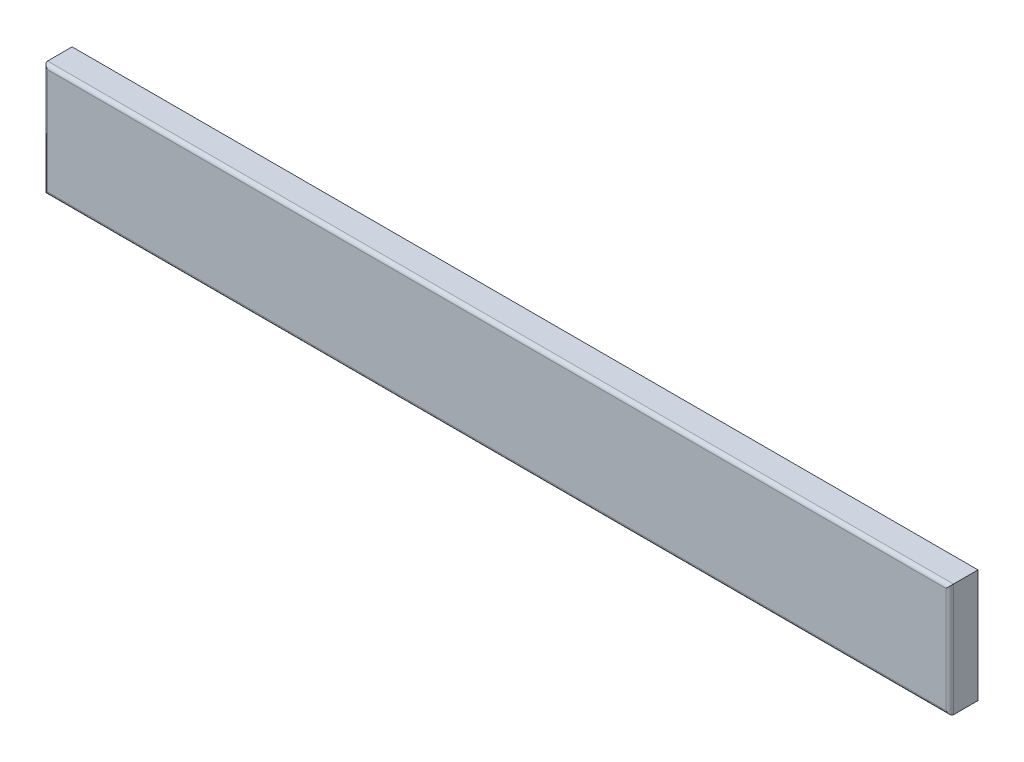
ISO-10303-21;
HEADER;
FILE_DESCRIPTION(('STEP AP214'),'2;1');
FILE_NAME('part.step','',(''),(''),'','','');
FILE_SCHEMA(('AUTOMOTIVE_DESIGN { 1 0 10303 214 1 1 1 1 }'));
ENDSEC;
DATA;
#1=APPLICATION_CONTEXT('core data for automotive mechanical design processes');
#2=APPLICATION_PROTOCOL_DEFINITION('international standard','automotive_design',2000,#1);
#3=PRODUCT_CONTEXT('',#1,'mechanical');
#4=PRODUCT('Part','Part','',(#3));
#5=PRODUCT_RELATED_PRODUCT_CATEGORY('part','',(#4));
#6=PRODUCT_DEFINITION_FORMATION('','',#4);
#7=PRODUCT_DEFINITION_CONTEXT('part definition',#1,'design');
#8=PRODUCT_DEFINITION('design','',#6,#7);
#9=PRODUCT_DEFINITION_SHAPE('','',#8);
#10=(LENGTH_UNIT() NAMED_UNIT(*) SI_UNIT(.MILLI.,.METRE.));
#11=(NAMED_UNIT(*) PLANE_ANGLE_UNIT() SI_UNIT($,.RADIAN.));
#12=(NAMED_UNIT(*) SI_UNIT($,.STERADIAN.) SOLID_ANGLE_UNIT());
#13=UNCERTAINTY_MEASURE_WITH_UNIT(LENGTH_MEASURE(1.E-05),#10,'distance_accuracy_value','');
#14=(GEOMETRIC_REPRESENTATION_CONTEXT(3) GLOBAL_UNCERTAINTY_ASSIGNED_CONTEXT((#13)) GLOBAL_UNIT_ASSIGNED_CONTEXT((#10,
#11,#12)) REPRESENTATION_CONTEXT('',''));
#15=CARTESIAN_POINT('',(0.,0.,0.));
#16=DIRECTION('',(0.,0.,1.));
#17=DIRECTION('',(1.,0.,0.));
#18=AXIS2_PLACEMENT_3D('',#15,#16,#17);
#19=CARTESIAN_POINT('',(304.8,-38.1,2.54));
#20=DIRECTION('',(-1.,0.,0.));
#21=DIRECTION('',(0.,0.,1.));
#22=AXIS2_PLACEMENT_3D('',#19,#20,#21);
#23=PLANE('',#22);
#24=DIRECTION('',(0.,0.,-1.));
#25=VECTOR('',#24,1.);
#26=CARTESIAN_POINT('',(304.8,38.1,2.54));
#27=LINE('',#26,#25);
#28=CARTESIAN_POINT('',(304.8,38.1,0.));
#29=VERTEX_POINT('',#28);
#30=CARTESIAN_POINT('',(304.8,38.1,-16.51));
#31=VERTEX_POINT('',#30);
#32=EDGE_CURVE('E167',#29,#31,#27,.T.);
#33=ORIENTED_EDGE('',*,*,#32,.F.);
#34=DIRECTION('',(0.,1.,0.));
#35=VECTOR('',#34,1.);
#36=CARTESIAN_POINT('',(304.8,-38.1,0.));
#37=LINE('',#36,#35);
#38=CARTESIAN_POINT('',(304.8,-38.1,0.));
#39=VERTEX_POINT('',#38);
#40=EDGE_CURVE('E11',#29,#39,#37,.F.);
#41=ORIENTED_EDGE('',*,*,#40,.T.);
#42=DIRECTION('',(0.,0.,-1.));
#43=VECTOR('',#42,1.);
#44=CARTESIAN_POINT('',(304.8,-38.1,2.54));
#45=LINE('',#44,#43);
#46=CARTESIAN_POINT('',(304.8,-38.1,-16.51));
#47=VERTEX_POINT('',#46);
#48=EDGE_CURVE('E161',#39,#47,#45,.T.);
#49=ORIENTED_EDGE('',*,*,#48,.T.);
#50=DIRECTION('',(0.,1.,0.));
#51=VECTOR('',#50,1.);
#52=CARTESIAN_POINT('',(304.8,-38.1,-16.51));
#53=LINE('',#52,#51);
#54=EDGE_CURVE('E152',#47,#31,#53,.T.);
#55=ORIENTED_EDGE('',*,*,#54,.T.);
#56=EDGE_LOOP('',(#33,#41,#49,#55));
#57=FACE_BOUND('',#56,.T.);
#58=ADVANCED_FACE('F33',(#57),#23,.F.);
#59=CARTESIAN_POINT('',(-304.8,38.1,2.54));
#60=DIRECTION('',(0.,-1.,0.));
#61=DIRECTION('',(0.,0.,-1.));
#62=AXIS2_PLACEMENT_3D('',#59,#60,#61);
#63=PLANE('',#62);
#64=DIRECTION('',(0.,0.,-1.));
#65=VECTOR('',#64,1.);
#66=CARTESIAN_POINT('',(-304.8,38.1,2.54));
#67=LINE('',#66,#65);
#68=CARTESIAN_POINT('',(-304.8,38.1,0.));
#69=VERTEX_POINT('',#68);
#70=CARTESIAN_POINT('',(-304.8,38.1,-16.51));
#71=VERTEX_POINT('',#70);
#72=EDGE_CURVE('E165',#69,#71,#67,.T.);
#73=ORIENTED_EDGE('',*,*,#72,.F.);
#74=DIRECTION('',(-1.,0.,0.));
#75=VECTOR('',#74,1.);
#76=CARTESIAN_POINT('',(-304.8,38.1,0.));
#77=LINE('',#76,#75);
#78=EDGE_CURVE('E42',#69,#29,#77,.F.);
#79=ORIENTED_EDGE('',*,*,#78,.T.);
#80=ORIENTED_EDGE('',*,*,#32,.T.);
#81=DIRECTION('',(-1.,0.,0.));
#82=VECTOR('',#81,1.);
#83=CARTESIAN_POINT('',(304.8,38.1,-16.51));
#84=LINE('',#83,#82);
#85=EDGE_CURVE('E155',#31,#71,#84,.T.);
#86=ORIENTED_EDGE('',*,*,#85,.T.);
#87=EDGE_LOOP('',(#73,#79,#80,#86));
#88=FACE_BOUND('',#87,.T.);
#89=ADVANCED_FACE('F222',(#88),#63,.F.);
#90=CARTESIAN_POINT('',(-304.8,-38.1,2.54));
#91=DIRECTION('',(1.,0.,0.));
#92=DIRECTION('',(0.,0.,-1.));
#93=AXIS2_PLACEMENT_3D('',#90,#91,#92);
#94=PLANE('',#93);
#95=DIRECTION('',(0.,0.,-1.));
#96=VECTOR('',#95,1.);
#97=CARTESIAN_POINT('',(-304.8,-38.1,2.54));
#98=LINE('',#97,#96);
#99=CARTESIAN_POINT('',(-304.8,-38.1,0.));
#100=VERTEX_POINT('',#99);
#101=CARTESIAN_POINT('',(-304.8,-38.1,-16.51));
#102=VERTEX_POINT('',#101);
#103=EDGE_CURVE('E163',#100,#102,#98,.T.);
#104=ORIENTED_EDGE('',*,*,#103,.F.);
#105=DIRECTION('',(0.,-1.,0.));
#106=VECTOR('',#105,1.);
#107=CARTESIAN_POINT('',(-304.8,-38.1,0.));
#108=LINE('',#107,#106);
#109=EDGE_CURVE('E57',#100,#69,#108,.F.);
#110=ORIENTED_EDGE('',*,*,#109,.T.);
#111=ORIENTED_EDGE('',*,*,#72,.T.);
#112=DIRECTION('',(0.,-1.,0.));
#113=VECTOR('',#112,1.);
#114=CARTESIAN_POINT('',(-304.8,38.1,-16.51));
#115=LINE('',#114,#113);
#116=EDGE_CURVE('E158',#71,#102,#115,.T.);
#117=ORIENTED_EDGE('',*,*,#116,.T.);
#118=EDGE_LOOP('',(#104,#110,#111,#117));
#119=FACE_BOUND('',#118,.T.);
#120=ADVANCED_FACE('F217',(#119),#94,.F.);
#121=CARTESIAN_POINT('',(-304.8,-38.1,2.54));
#122=DIRECTION('',(0.,1.,0.));
#123=DIRECTION('',(0.,0.,1.));
#124=AXIS2_PLACEMENT_3D('',#121,#122,#123);
#125=PLANE('',#124);
#126=ORIENTED_EDGE('',*,*,#48,.F.);
#127=DIRECTION('',(1.,0.,0.));
#128=VECTOR('',#127,1.);
#129=CARTESIAN_POINT('',(-304.8,-38.1,0.));
#130=LINE('',#129,#128);
#131=EDGE_CURVE('E187',#39,#100,#130,.F.);
#132=ORIENTED_EDGE('',*,*,#131,.T.);
#133=ORIENTED_EDGE('',*,*,#103,.T.);
#134=DIRECTION('',(1.,0.,0.));
#135=VECTOR('',#134,1.);
#136=CARTESIAN_POINT('',(-304.8,-38.1,-16.51));
#137=LINE('',#136,#135);
#138=EDGE_CURVE('E145',#102,#47,#137,.T.);
#139=ORIENTED_EDGE('',*,*,#138,.T.);
#140=EDGE_LOOP('',(#126,#132,#133,#139));
#141=FACE_BOUND('',#140,.T.);
#142=ADVANCED_FACE('F215',(#141),#125,.F.);
#143=CARTESIAN_POINT('',(0.,0.,2.54));
#144=DIRECTION('',(0.,0.,-1.));
#145=DIRECTION('',(-1.,0.,0.));
#146=AXIS2_PLACEMENT_3D('',#143,#144,#145);
#147=PLANE('',#146);
#148=DIRECTION('',(0.,-1.,0.));
#149=VECTOR('',#148,1.);
#150=CARTESIAN_POINT('',(-302.26,0.,2.54));
#151=LINE('',#150,#149);
#152=CARTESIAN_POINT('',(-302.26,35.56,2.54));
#153=VERTEX_POINT('',#152);
#154=CARTESIAN_POINT('',(-302.26,-35.56,2.54));
#155=VERTEX_POINT('',#154);
#156=EDGE_CURVE('E182',#153,#155,#151,.T.);
#157=ORIENTED_EDGE('',*,*,#156,.T.);
#158=DIRECTION('',(1.,0.,0.));
#159=VECTOR('',#158,1.);
#160=CARTESIAN_POINT('',(0.,-35.56,2.54));
#161=LINE('',#160,#159);
#162=CARTESIAN_POINT('',(302.26,-35.56,2.54));
#163=VERTEX_POINT('',#162);
#164=EDGE_CURVE('E184',#155,#163,#161,.T.);
#165=ORIENTED_EDGE('',*,*,#164,.T.);
#166=DIRECTION('',(0.,1.,0.));
#167=VECTOR('',#166,1.);
#168=CARTESIAN_POINT('',(302.26,0.,2.54));
#169=LINE('',#168,#167);
#170=CARTESIAN_POINT('',(302.26,35.56,2.54));
#171=VERTEX_POINT('',#170);
#172=EDGE_CURVE('E178',#163,#171,#169,.T.);
#173=ORIENTED_EDGE('',*,*,#172,.T.);
#174=DIRECTION('',(-1.,0.,0.));
#175=VECTOR('',#174,1.);
#176=CARTESIAN_POINT('',(0.,35.56,2.54));
#177=LINE('',#176,#175);
#178=EDGE_CURVE('E180',#171,#153,#177,.T.);
#179=ORIENTED_EDGE('',*,*,#178,.T.);
#180=EDGE_LOOP('',(#157,#165,#173,#179));
#181=FACE_BOUND('',#180,.T.);
#182=ADVANCED_FACE('F207',(#181),#147,.F.);
#183=CARTESIAN_POINT('',(0.,0.,-16.51));
#184=DIRECTION('',(0.,0.,1.));
#185=DIRECTION('',(1.,0.,0.));
#186=AXIS2_PLACEMENT_3D('',#183,#184,#185);
#187=PLANE('',#186);
#188=DIRECTION('',(1.,0.,0.));
#189=VECTOR('',#188,1.);
#190=CARTESIAN_POINT('',(-302.26,-35.56,-16.51));
#191=LINE('',#190,#189);
#192=CARTESIAN_POINT('',(-302.26,-35.56,-16.51));
#193=VERTEX_POINT('',#192);
#194=CARTESIAN_POINT('',(302.26,-35.56,-16.51));
#195=VERTEX_POINT('',#194);
#196=EDGE_CURVE('E123',#193,#195,#191,.T.);
#197=ORIENTED_EDGE('',*,*,#196,.T.);
#198=DIRECTION('',(0.,1.,0.));
#199=VECTOR('',#198,1.);
#200=CARTESIAN_POINT('',(302.26,-35.56,-16.51));
#201=LINE('',#200,#199);
#202=CARTESIAN_POINT('',(302.26,35.56,-16.51));
#203=VERTEX_POINT('',#202);
#204=EDGE_CURVE('E116',#195,#203,#201,.T.);
#205=ORIENTED_EDGE('',*,*,#204,.T.);
#206=DIRECTION('',(-1.,0.,0.));
#207=VECTOR('',#206,1.);
#208=CARTESIAN_POINT('',(302.26,35.56,-16.51));
#209=LINE('',#208,#207);
#210=CARTESIAN_POINT('',(-302.26,35.56,-16.51));
#211=VERTEX_POINT('',#210);
#212=EDGE_CURVE('E127',#203,#211,#209,.T.);
#213=ORIENTED_EDGE('',*,*,#212,.T.);
#214=DIRECTION('',(0.,-1.,0.));
#215=VECTOR('',#214,1.);
#216=CARTESIAN_POINT('',(-302.26,35.56,-16.51));
#217=LINE('',#216,#215);
#218=EDGE_CURVE('E132',#211,#193,#217,.T.);
#219=ORIENTED_EDGE('',*,*,#218,.T.);
#220=EDGE_LOOP('',(#197,#205,#213,#219));
#221=FACE_BOUND('',#220,.T.);
#222=ORIENTED_EDGE('',*,*,#138,.F.);
#223=ORIENTED_EDGE('',*,*,#116,.F.);
#224=ORIENTED_EDGE('',*,*,#85,.F.);
#225=ORIENTED_EDGE('',*,*,#54,.F.);
#226=EDGE_LOOP('',(#222,#223,#224,#225));
#227=FACE_BOUND('',#226,.T.);
#228=ADVANCED_FACE('F134',(#221,#227),#187,.F.);
#229=CARTESIAN_POINT('',(302.26,-35.56,-16.51));
#230=DIRECTION('',(1.,0.,0.));
#231=DIRECTION('',(0.,0.,-1.));
#232=AXIS2_PLACEMENT_3D('',#229,#230,#231);
#233=PLANE('',#232);
#234=DIRECTION('',(0.,-1.,0.));
#235=VECTOR('',#234,1.);
#236=CARTESIAN_POINT('',(302.26,0.,0.));
#237=LINE('',#236,#235);
#238=CARTESIAN_POINT('',(302.26,35.56,0.));
#239=VERTEX_POINT('',#238);
#240=CARTESIAN_POINT('',(302.26,-35.56,0.));
#241=VERTEX_POINT('',#240);
#242=EDGE_CURVE('E119',#239,#241,#237,.T.);
#243=ORIENTED_EDGE('',*,*,#242,.F.);
#244=DIRECTION('',(0.,0.,1.));
#245=VECTOR('',#244,1.);
#246=CARTESIAN_POINT('',(302.26,35.56,-16.51));
#247=LINE('',#246,#245);
#248=EDGE_CURVE('E111',#203,#239,#247,.T.);
#249=ORIENTED_EDGE('',*,*,#248,.F.);
#250=ORIENTED_EDGE('',*,*,#204,.F.);
#251=DIRECTION('',(0.,0.,1.));
#252=VECTOR('',#251,1.);
#253=CARTESIAN_POINT('',(302.26,-35.56,-16.51));
#254=LINE('',#253,#252);
#255=EDGE_CURVE('E143',#195,#241,#254,.T.);
#256=ORIENTED_EDGE('',*,*,#255,.T.);
#257=EDGE_LOOP('',(#243,#249,#250,#256));
#258=FACE_BOUND('',#257,.T.);
#259=ADVANCED_FACE('F113',(#258),#233,.F.);
#260=CARTESIAN_POINT('',(-302.26,-35.56,-16.51));
#261=DIRECTION('',(0.,-1.,0.));
#262=DIRECTION('',(0.,0.,-1.));
#263=AXIS2_PLACEMENT_3D('',#260,#261,#262);
#264=PLANE('',#263);
#265=DIRECTION('',(-1.,0.,0.));
#266=VECTOR('',#265,1.);
#267=CARTESIAN_POINT('',(0.,-35.56,0.));
#268=LINE('',#267,#266);
#269=CARTESIAN_POINT('',(-302.26,-35.56,0.));
#270=VERTEX_POINT('',#269);
#271=EDGE_CURVE('E174',#241,#270,#268,.T.);
#272=ORIENTED_EDGE('',*,*,#271,.F.);
#273=ORIENTED_EDGE('',*,*,#255,.F.);
#274=ORIENTED_EDGE('',*,*,#196,.F.);
#275=DIRECTION('',(0.,0.,1.));
#276=VECTOR('',#275,1.);
#277=CARTESIAN_POINT('',(-302.26,-35.56,-16.51));
#278=LINE('',#277,#276);
#279=EDGE_CURVE('E146',#193,#270,#278,.T.);
#280=ORIENTED_EDGE('',*,*,#279,.T.);
#281=EDGE_LOOP('',(#272,#273,#274,#280));
#282=FACE_BOUND('',#281,.T.);
#283=ADVANCED_FACE('F265',(#282),#264,.F.);
#284=CARTESIAN_POINT('',(-302.26,35.56,-16.51));
#285=DIRECTION('',(-1.,0.,0.));
#286=DIRECTION('',(0.,0.,1.));
#287=AXIS2_PLACEMENT_3D('',#284,#285,#286);
#288=PLANE('',#287);
#289=DIRECTION('',(0.,1.,0.));
#290=VECTOR('',#289,1.);
#291=CARTESIAN_POINT('',(-302.26,0.,0.));
#292=LINE('',#291,#290);
#293=CARTESIAN_POINT('',(-302.26,35.56,0.));
#294=VERTEX_POINT('',#293);
#295=EDGE_CURVE('E171',#270,#294,#292,.T.);
#296=ORIENTED_EDGE('',*,*,#295,.F.);
#297=ORIENTED_EDGE('',*,*,#279,.F.);
#298=ORIENTED_EDGE('',*,*,#218,.F.);
#299=DIRECTION('',(0.,0.,1.));
#300=VECTOR('',#299,1.);
#301=CARTESIAN_POINT('',(-302.26,35.56,-16.51));
#302=LINE('',#301,#300);
#303=EDGE_CURVE('E122',#211,#294,#302,.T.);
#304=ORIENTED_EDGE('',*,*,#303,.T.);
#305=EDGE_LOOP('',(#296,#297,#298,#304));
#306=FACE_BOUND('',#305,.T.);
#307=ADVANCED_FACE('F251',(#306),#288,.F.);
#308=CARTESIAN_POINT('',(302.26,35.56,-16.51));
#309=DIRECTION('',(0.,1.,0.));
#310=DIRECTION('',(0.,0.,1.));
#311=AXIS2_PLACEMENT_3D('',#308,#309,#310);
#312=PLANE('',#311);
#313=DIRECTION('',(1.,0.,0.));
#314=VECTOR('',#313,1.);
#315=CARTESIAN_POINT('',(0.,35.56,0.));
#316=LINE('',#315,#314);
#317=EDGE_CURVE('E169',#294,#239,#316,.T.);
#318=ORIENTED_EDGE('',*,*,#317,.F.);
#319=ORIENTED_EDGE('',*,*,#303,.F.);
#320=ORIENTED_EDGE('',*,*,#212,.F.);
#321=ORIENTED_EDGE('',*,*,#248,.T.);
#322=EDGE_LOOP('',(#318,#319,#320,#321));
#323=FACE_BOUND('',#322,.T.);
#324=ADVANCED_FACE('F128',(#323),#312,.F.);
#325=CARTESIAN_POINT('',(0.,0.,0.));
#326=DIRECTION('',(0.,0.,-1.));
#327=DIRECTION('',(-1.,0.,0.));
#328=AXIS2_PLACEMENT_3D('',#325,#326,#327);
#329=PLANE('',#328);
#330=ORIENTED_EDGE('',*,*,#317,.T.);
#331=ORIENTED_EDGE('',*,*,#242,.T.);
#332=ORIENTED_EDGE('',*,*,#271,.T.);
#333=ORIENTED_EDGE('',*,*,#295,.T.);
#334=EDGE_LOOP('',(#330,#331,#332,#333));
#335=FACE_BOUND('',#334,.T.);
#336=ADVANCED_FACE('F242',(#335),#329,.T.);
#337=CARTESIAN_POINT('',(0.,35.56,0.));
#338=DIRECTION('',(-1.,0.,0.));
#339=DIRECTION('',(0.,0.,1.));
#340=AXIS2_PLACEMENT_3D('',#337,#338,#339);
#341=CYLINDRICAL_SURFACE('',#340,2.54);
#342=CARTESIAN_POINT('',(302.26,35.56,0.));
#343=DIRECTION('',(-0.707106781186547,0.707106781186547,0.));
#344=DIRECTION('',(0.707106781186547,0.707106781186547,0.));
#345=AXIS2_PLACEMENT_3D('',#342,#343,#344);
#346=ELLIPSE('',#345,3.59210244842766,2.54);
#347=EDGE_CURVE('E139',#29,#171,#346,.F.);
#348=ORIENTED_EDGE('',*,*,#347,.F.);
#349=ORIENTED_EDGE('',*,*,#78,.F.);
#350=CARTESIAN_POINT('',(-302.26,35.56,0.));
#351=DIRECTION('',(-0.707106781186547,-0.707106781186547,0.));
#352=DIRECTION('',(-0.707106781186547,0.707106781186547,0.));
#353=AXIS2_PLACEMENT_3D('',#350,#351,#352);
#354=ELLIPSE('',#353,3.59210244842766,2.54);
#355=EDGE_CURVE('E37',#153,#69,#354,.T.);
#356=ORIENTED_EDGE('',*,*,#355,.F.);
#357=ORIENTED_EDGE('',*,*,#178,.F.);
#358=EDGE_LOOP('',(#348,#349,#356,#357));
#359=FACE_BOUND('',#358,.T.);
#360=ADVANCED_FACE('F35',(#359),#341,.T.);
#361=CARTESIAN_POINT('',(-302.26,0.,0.));
#362=DIRECTION('',(0.,-1.,0.));
#363=DIRECTION('',(0.,0.,-1.));
#364=AXIS2_PLACEMENT_3D('',#361,#362,#363);
#365=CYLINDRICAL_SURFACE('',#364,2.54);
#366=ORIENTED_EDGE('',*,*,#355,.T.);
#367=ORIENTED_EDGE('',*,*,#109,.F.);
#368=CARTESIAN_POINT('',(-302.26,-35.56,0.));
#369=DIRECTION('',(0.707106781186547,-0.707106781186547,0.));
#370=DIRECTION('',(-0.707106781186547,-0.707106781186547,0.));
#371=AXIS2_PLACEMENT_3D('',#368,#369,#370);
#372=ELLIPSE('',#371,3.59210244842766,2.54);
#373=EDGE_CURVE('E194',#155,#100,#372,.T.);
#374=ORIENTED_EDGE('',*,*,#373,.F.);
#375=ORIENTED_EDGE('',*,*,#156,.F.);
#376=EDGE_LOOP('',(#366,#367,#374,#375));
#377=FACE_BOUND('',#376,.T.);
#378=ADVANCED_FACE('F236',(#377),#365,.T.);
#379=CARTESIAN_POINT('',(302.26,0.,0.));
#380=DIRECTION('',(0.,1.,0.));
#381=DIRECTION('',(0.,0.,1.));
#382=AXIS2_PLACEMENT_3D('',#379,#380,#381);
#383=CYLINDRICAL_SURFACE('',#382,2.54);
#384=ORIENTED_EDGE('',*,*,#347,.T.);
#385=ORIENTED_EDGE('',*,*,#172,.F.);
#386=CARTESIAN_POINT('',(302.26,-35.56,0.));
#387=DIRECTION('',(0.707106781186547,0.707106781186547,0.));
#388=DIRECTION('',(-0.707106781186547,0.707106781186547,0.));
#389=AXIS2_PLACEMENT_3D('',#386,#387,#388);
#390=ELLIPSE('',#389,3.59210244842766,2.54);
#391=EDGE_CURVE('E192',#39,#163,#390,.F.);
#392=ORIENTED_EDGE('',*,*,#391,.F.);
#393=ORIENTED_EDGE('',*,*,#40,.F.);
#394=EDGE_LOOP('',(#384,#385,#392,#393));
#395=FACE_BOUND('',#394,.T.);
#396=ADVANCED_FACE('F200',(#395),#383,.T.);
#397=CARTESIAN_POINT('',(0.,-35.56,0.));
#398=DIRECTION('',(1.,0.,0.));
#399=DIRECTION('',(0.,0.,-1.));
#400=AXIS2_PLACEMENT_3D('',#397,#398,#399);
#401=CYLINDRICAL_SURFACE('',#400,2.54);
#402=ORIENTED_EDGE('',*,*,#373,.T.);
#403=ORIENTED_EDGE('',*,*,#131,.F.);
#404=ORIENTED_EDGE('',*,*,#391,.T.);
#405=ORIENTED_EDGE('',*,*,#164,.F.);
#406=EDGE_LOOP('',(#402,#403,#404,#405));
#407=FACE_BOUND('',#406,.T.);
#408=ADVANCED_FACE('F211',(#407),#401,.T.);
#409=CLOSED_SHELL('',(#58,#89,#120,#142,#182,#228,#259,#283,#307,#324,#336,#360,#378,#396,#408));
#410=MANIFOLD_SOLID_BREP('B2',#409);
#411=ADVANCED_BREP_SHAPE_REPRESENTATION('',(#18,#410),#14);
#412=SHAPE_DEFINITION_REPRESENTATION(#9,#411);
ENDSEC;
END-ISO-10303-21;
